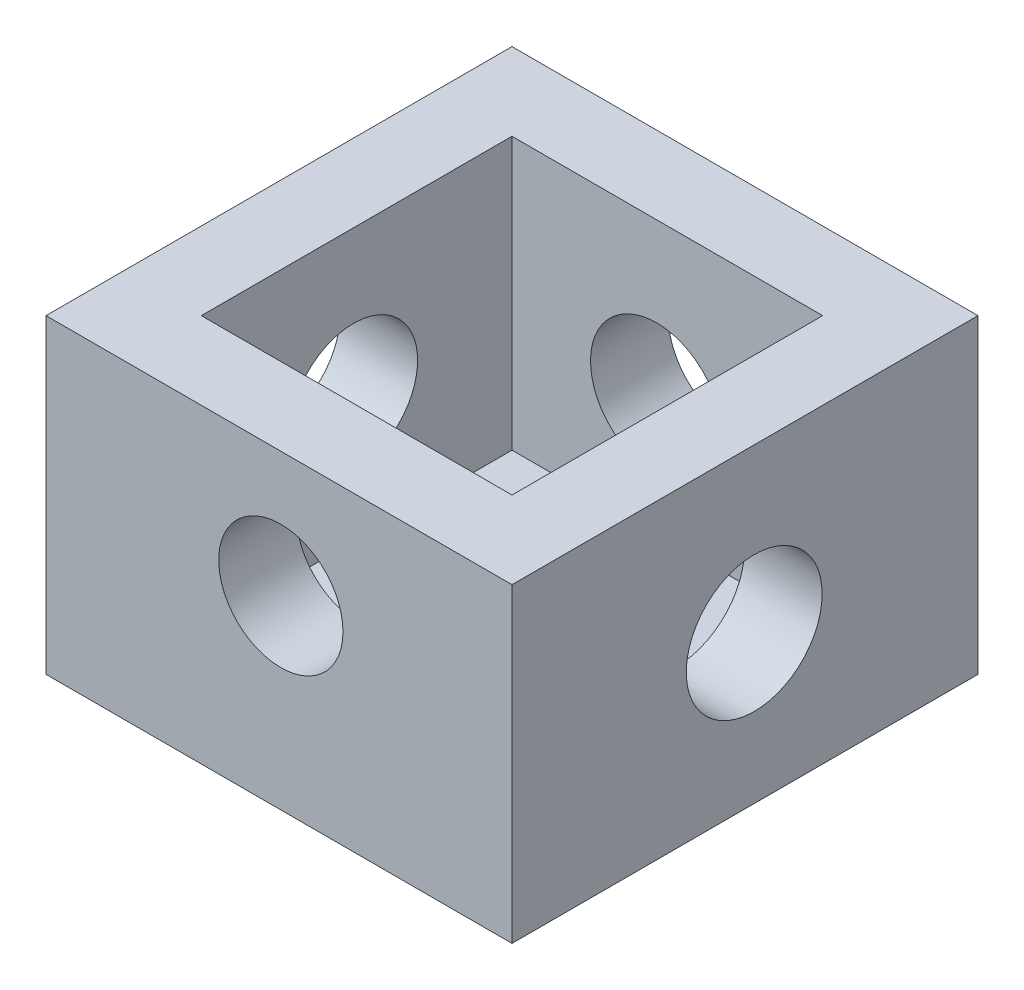
ISO-10303-21;
HEADER;
FILE_DESCRIPTION(('STEP AP214'),'2;1');
FILE_NAME('part.step','',(''),(''),'','','');
FILE_SCHEMA(('AUTOMOTIVE_DESIGN { 1 0 10303 214 1 1 1 1 }'));
ENDSEC;
DATA;
#1=APPLICATION_CONTEXT('core data for automotive mechanical design processes');
#2=APPLICATION_PROTOCOL_DEFINITION('international standard','automotive_design',2000,#1);
#3=PRODUCT_CONTEXT('',#1,'mechanical');
#4=PRODUCT('Part','Part','',(#3));
#5=PRODUCT_RELATED_PRODUCT_CATEGORY('part','',(#4));
#6=PRODUCT_DEFINITION_FORMATION('','',#4);
#7=PRODUCT_DEFINITION_CONTEXT('part definition',#1,'design');
#8=PRODUCT_DEFINITION('design','',#6,#7);
#9=PRODUCT_DEFINITION_SHAPE('','',#8);
#10=(LENGTH_UNIT() NAMED_UNIT(*) SI_UNIT(.MILLI.,.METRE.));
#11=(NAMED_UNIT(*) PLANE_ANGLE_UNIT() SI_UNIT($,.RADIAN.));
#12=(NAMED_UNIT(*) SI_UNIT($,.STERADIAN.) SOLID_ANGLE_UNIT());
#13=UNCERTAINTY_MEASURE_WITH_UNIT(LENGTH_MEASURE(1.E-05),#10,'distance_accuracy_value','');
#14=(GEOMETRIC_REPRESENTATION_CONTEXT(3) GLOBAL_UNCERTAINTY_ASSIGNED_CONTEXT((#13)) GLOBAL_UNIT_ASSIGNED_CONTEXT((#10,
#11,#12)) REPRESENTATION_CONTEXT('',''));
#15=CARTESIAN_POINT('',(0.,0.,0.));
#16=DIRECTION('',(0.,0.,1.));
#17=DIRECTION('',(1.,0.,0.));
#18=AXIS2_PLACEMENT_3D('',#15,#16,#17);
#19=CARTESIAN_POINT('',(-47.6315789473684,40.,-77.2368421052632));
#20=DIRECTION('',(0.,0.,1.));
#21=DIRECTION('',(1.,0.,0.));
#22=AXIS2_PLACEMENT_3D('',#19,#20,#21);
#23=PLANE('',#22);
#24=DIRECTION('',(-1.,0.,0.));
#25=VECTOR('',#24,1.);
#26=CARTESIAN_POINT('',(-47.6315789473684,0.,-77.2368421052632));
#27=LINE('',#26,#25);
#28=CARTESIAN_POINT('',(12.3684210526316,0.,-77.2368421052632));
#29=VERTEX_POINT('',#28);
#30=CARTESIAN_POINT('',(-47.6315789473684,0.,-77.2368421052632));
#31=VERTEX_POINT('',#30);
#32=EDGE_CURVE('E158',#29,#31,#27,.T.);
#33=ORIENTED_EDGE('',*,*,#32,.T.);
#34=DIRECTION('',(0.,-1.,0.));
#35=VECTOR('',#34,1.);
#36=CARTESIAN_POINT('',(-47.6315789473684,40.,-77.2368421052632));
#37=LINE('',#36,#35);
#38=CARTESIAN_POINT('',(-47.6315789473684,40.,-77.2368421052632));
#39=VERTEX_POINT('',#38);
#40=EDGE_CURVE('E41',#39,#31,#37,.T.);
#41=ORIENTED_EDGE('',*,*,#40,.F.);
#42=DIRECTION('',(-1.,0.,0.));
#43=VECTOR('',#42,1.);
#44=CARTESIAN_POINT('',(-47.6315789473684,40.,-77.2368421052632));
#45=LINE('',#44,#43);
#46=CARTESIAN_POINT('',(12.3684210526316,40.,-77.2368421052632));
#47=VERTEX_POINT('',#46);
#48=EDGE_CURVE('E85',#47,#39,#45,.T.);
#49=ORIENTED_EDGE('',*,*,#48,.F.);
#50=DIRECTION('',(0.,-1.,0.));
#51=VECTOR('',#50,1.);
#52=CARTESIAN_POINT('',(12.3684210526316,40.,-77.2368421052632));
#53=LINE('',#52,#51);
#54=EDGE_CURVE('E11',#47,#29,#53,.T.);
#55=ORIENTED_EDGE('',*,*,#54,.T.);
#56=EDGE_LOOP('',(#33,#41,#49,#55));
#57=FACE_BOUND('',#56,.T.);
#58=CARTESIAN_POINT('',(-19.022665383632,20.0118224268138,-77.2368421052632));
#59=DIRECTION('',(0.,0.,-1.));
#60=DIRECTION('',(-1.,0.,0.));
#61=AXIS2_PLACEMENT_3D('',#58,#59,#60);
#62=CIRCLE('',#61,8.5);
#63=CARTESIAN_POINT('',(-27.522665383632,20.0118224268138,-77.2368421052632));
#64=VERTEX_POINT('',#63);
#65=EDGE_CURVE('E200',#64,#64,#62,.T.);
#66=ORIENTED_EDGE('',*,*,#65,.F.);
#67=EDGE_LOOP('',(#66));
#68=FACE_BOUND('',#67,.T.);
#69=ADVANCED_FACE('F33',(#57,#68),#23,.F.);
#70=CARTESIAN_POINT('',(-47.6315789473684,40.,-77.2368421052632));
#71=DIRECTION('',(1.,0.,0.));
#72=DIRECTION('',(0.,0.,-1.));
#73=AXIS2_PLACEMENT_3D('',#70,#71,#72);
#74=PLANE('',#73);
#75=DIRECTION('',(0.,0.,1.));
#76=VECTOR('',#75,1.);
#77=CARTESIAN_POINT('',(-47.6315789473684,0.,-77.2368421052632));
#78=LINE('',#77,#76);
#79=CARTESIAN_POINT('',(-47.6315789473684,0.,-17.2368421052632));
#80=VERTEX_POINT('',#79);
#81=EDGE_CURVE('E160',#31,#80,#78,.T.);
#82=ORIENTED_EDGE('',*,*,#81,.T.);
#83=DIRECTION('',(0.,-1.,0.));
#84=VECTOR('',#83,1.);
#85=CARTESIAN_POINT('',(-47.6315789473684,40.,-17.2368421052632));
#86=LINE('',#85,#84);
#87=CARTESIAN_POINT('',(-47.6315789473684,40.,-17.2368421052632));
#88=VERTEX_POINT('',#87);
#89=EDGE_CURVE('E164',#88,#80,#86,.T.);
#90=ORIENTED_EDGE('',*,*,#89,.F.);
#91=DIRECTION('',(0.,0.,1.));
#92=VECTOR('',#91,1.);
#93=CARTESIAN_POINT('',(-47.6315789473684,40.,-77.2368421052632));
#94=LINE('',#93,#92);
#95=EDGE_CURVE('E152',#39,#88,#94,.T.);
#96=ORIENTED_EDGE('',*,*,#95,.F.);
#97=ORIENTED_EDGE('',*,*,#40,.T.);
#98=EDGE_LOOP('',(#82,#90,#96,#97));
#99=FACE_BOUND('',#98,.T.);
#100=CARTESIAN_POINT('',(-47.6315789473684,21.0932716684626,-46.8351131772574));
#101=DIRECTION('',(-1.,0.,0.));
#102=DIRECTION('',(0.,0.,1.));
#103=AXIS2_PLACEMENT_3D('',#100,#101,#102);
#104=CIRCLE('',#103,8.25);
#105=CARTESIAN_POINT('',(-47.6315789473684,21.0932716684626,-38.5851131772574));
#106=VERTEX_POINT('',#105);
#107=EDGE_CURVE('E205',#106,#106,#104,.T.);
#108=ORIENTED_EDGE('',*,*,#107,.F.);
#109=EDGE_LOOP('',(#108));
#110=FACE_BOUND('',#109,.T.);
#111=ADVANCED_FACE('F169',(#99,#110),#74,.F.);
#112=CARTESIAN_POINT('',(12.3684210526316,40.,-77.2368421052632));
#113=DIRECTION('',(-1.,0.,0.));
#114=DIRECTION('',(0.,0.,1.));
#115=AXIS2_PLACEMENT_3D('',#112,#113,#114);
#116=PLANE('',#115);
#117=DIRECTION('',(0.,0.,-1.));
#118=VECTOR('',#117,1.);
#119=CARTESIAN_POINT('',(12.3684210526316,0.,-77.2368421052632));
#120=LINE('',#119,#118);
#121=CARTESIAN_POINT('',(12.3684210526316,0.,-17.2368421052632));
#122=VERTEX_POINT('',#121);
#123=EDGE_CURVE('E145',#122,#29,#120,.T.);
#124=ORIENTED_EDGE('',*,*,#123,.T.);
#125=ORIENTED_EDGE('',*,*,#54,.F.);
#126=DIRECTION('',(0.,0.,-1.));
#127=VECTOR('',#126,1.);
#128=CARTESIAN_POINT('',(12.3684210526316,40.,-77.2368421052632));
#129=LINE('',#128,#127);
#130=CARTESIAN_POINT('',(12.3684210526316,40.,-17.2368421052632));
#131=VERTEX_POINT('',#130);
#132=EDGE_CURVE('E149',#131,#47,#129,.T.);
#133=ORIENTED_EDGE('',*,*,#132,.F.);
#134=DIRECTION('',(0.,-1.,0.));
#135=VECTOR('',#134,1.);
#136=CARTESIAN_POINT('',(12.3684210526316,40.,-17.2368421052632));
#137=LINE('',#136,#135);
#138=EDGE_CURVE('E155',#131,#122,#137,.T.);
#139=ORIENTED_EDGE('',*,*,#138,.T.);
#140=EDGE_LOOP('',(#124,#125,#133,#139));
#141=FACE_BOUND('',#140,.T.);
#142=CARTESIAN_POINT('',(12.3684210526316,19.0144091342364,-48.4215666866429));
#143=DIRECTION('',(1.,0.,0.));
#144=DIRECTION('',(0.,0.,-1.));
#145=AXIS2_PLACEMENT_3D('',#142,#143,#144);
#146=CIRCLE('',#145,8.75);
#147=CARTESIAN_POINT('',(12.3684210526316,19.0144091342364,-57.1715666866429));
#148=VERTEX_POINT('',#147);
#149=EDGE_CURVE('E213',#148,#148,#146,.T.);
#150=ORIENTED_EDGE('',*,*,#149,.F.);
#151=EDGE_LOOP('',(#150));
#152=FACE_BOUND('',#151,.T.);
#153=ADVANCED_FACE('F35',(#141,#152),#116,.F.);
#154=CARTESIAN_POINT('',(-47.6315789473684,40.,-17.2368421052632));
#155=DIRECTION('',(0.,0.,-1.));
#156=DIRECTION('',(-1.,0.,0.));
#157=AXIS2_PLACEMENT_3D('',#154,#155,#156);
#158=PLANE('',#157);
#159=CARTESIAN_POINT('',(-17.3938566500453,23.8673899247033,-17.2368421052632));
#160=DIRECTION('',(0.,0.,1.));
#161=DIRECTION('',(1.,0.,0.));
#162=AXIS2_PLACEMENT_3D('',#159,#160,#161);
#163=CIRCLE('',#162,8.);
#164=CARTESIAN_POINT('',(-9.39385665004534,23.8673899247033,-17.2368421052632));
#165=VERTEX_POINT('',#164);
#166=EDGE_CURVE('E218',#165,#165,#163,.T.);
#167=ORIENTED_EDGE('',*,*,#166,.F.);
#168=EDGE_LOOP('',(#167));
#169=FACE_BOUND('',#168,.T.);
#170=DIRECTION('',(1.,0.,0.));
#171=VECTOR('',#170,1.);
#172=CARTESIAN_POINT('',(-47.6315789473684,0.,-17.2368421052632));
#173=LINE('',#172,#171);
#174=EDGE_CURVE('E78',#80,#122,#173,.T.);
#175=ORIENTED_EDGE('',*,*,#174,.T.);
#176=ORIENTED_EDGE('',*,*,#138,.F.);
#177=DIRECTION('',(1.,0.,0.));
#178=VECTOR('',#177,1.);
#179=CARTESIAN_POINT('',(-47.6315789473684,40.,-17.2368421052632));
#180=LINE('',#179,#178);
#181=EDGE_CURVE('E57',#88,#131,#180,.T.);
#182=ORIENTED_EDGE('',*,*,#181,.F.);
#183=ORIENTED_EDGE('',*,*,#89,.T.);
#184=EDGE_LOOP('',(#175,#176,#182,#183));
#185=FACE_BOUND('',#184,.T.);
#186=ADVANCED_FACE('F179',(#169,#185),#158,.F.);
#187=CARTESIAN_POINT('',(0.,40.,0.));
#188=DIRECTION('',(0.,1.,0.));
#189=DIRECTION('',(0.,0.,1.));
#190=AXIS2_PLACEMENT_3D('',#187,#188,#189);
#191=PLANE('',#190);
#192=DIRECTION('',(0.,0.,-1.));
#193=VECTOR('',#192,1.);
#194=CARTESIAN_POINT('',(2.36842105263158,40.,-67.2368421052632));
#195=LINE('',#194,#193);
#196=CARTESIAN_POINT('',(2.36842105263158,40.,-27.2368421052632));
#197=VERTEX_POINT('',#196);
#198=CARTESIAN_POINT('',(2.36842105263158,40.,-67.2368421052632));
#199=VERTEX_POINT('',#198);
#200=EDGE_CURVE('E48',#197,#199,#195,.T.);
#201=ORIENTED_EDGE('',*,*,#200,.F.);
#202=DIRECTION('',(1.,0.,0.));
#203=VECTOR('',#202,1.);
#204=CARTESIAN_POINT('',(-37.6315789473684,40.,-27.2368421052632));
#205=LINE('',#204,#203);
#206=CARTESIAN_POINT('',(-37.6315789473684,40.,-27.2368421052632));
#207=VERTEX_POINT('',#206);
#208=EDGE_CURVE('E127',#207,#197,#205,.T.);
#209=ORIENTED_EDGE('',*,*,#208,.F.);
#210=DIRECTION('',(0.,0.,1.));
#211=VECTOR('',#210,1.);
#212=CARTESIAN_POINT('',(-37.6315789473684,40.,-67.2368421052632));
#213=LINE('',#212,#211);
#214=CARTESIAN_POINT('',(-37.6315789473684,40.,-67.2368421052632));
#215=VERTEX_POINT('',#214);
#216=EDGE_CURVE('E130',#215,#207,#213,.T.);
#217=ORIENTED_EDGE('',*,*,#216,.F.);
#218=DIRECTION('',(-1.,0.,0.));
#219=VECTOR('',#218,1.);
#220=CARTESIAN_POINT('',(-37.6315789473684,40.,-67.2368421052632));
#221=LINE('',#220,#219);
#222=EDGE_CURVE('E139',#199,#215,#221,.T.);
#223=ORIENTED_EDGE('',*,*,#222,.F.);
#224=EDGE_LOOP('',(#201,#209,#217,#223));
#225=FACE_BOUND('',#224,.T.);
#226=ORIENTED_EDGE('',*,*,#132,.T.);
#227=ORIENTED_EDGE('',*,*,#48,.T.);
#228=ORIENTED_EDGE('',*,*,#95,.T.);
#229=ORIENTED_EDGE('',*,*,#181,.T.);
#230=EDGE_LOOP('',(#226,#227,#228,#229));
#231=FACE_BOUND('',#230,.T.);
#232=ADVANCED_FACE('F181',(#225,#231),#191,.T.);
#233=CARTESIAN_POINT('',(0.,0.,0.));
#234=DIRECTION('',(0.,1.,0.));
#235=DIRECTION('',(0.,0.,1.));
#236=AXIS2_PLACEMENT_3D('',#233,#234,#235);
#237=PLANE('',#236);
#238=ORIENTED_EDGE('',*,*,#123,.F.);
#239=ORIENTED_EDGE('',*,*,#174,.F.);
#240=ORIENTED_EDGE('',*,*,#81,.F.);
#241=ORIENTED_EDGE('',*,*,#32,.F.);
#242=EDGE_LOOP('',(#238,#239,#240,#241));
#243=FACE_BOUND('',#242,.T.);
#244=ADVANCED_FACE('F174',(#243),#237,.F.);
#245=CARTESIAN_POINT('',(2.36842105263158,5.,-67.2368421052632));
#246=DIRECTION('',(1.,0.,0.));
#247=DIRECTION('',(0.,0.,-1.));
#248=AXIS2_PLACEMENT_3D('',#245,#246,#247);
#249=PLANE('',#248);
#250=CARTESIAN_POINT('',(2.36842105263158,19.0144091342364,-48.4215666866429));
#251=DIRECTION('',(1.,0.,0.));
#252=DIRECTION('',(0.,0.,-1.));
#253=AXIS2_PLACEMENT_3D('',#250,#251,#252);
#254=CIRCLE('',#253,8.75);
#255=CARTESIAN_POINT('',(2.36842105263158,19.0144091342364,-57.1715666866429));
#256=VERTEX_POINT('',#255);
#257=EDGE_CURVE('E216',#256,#256,#254,.T.);
#258=ORIENTED_EDGE('',*,*,#257,.T.);
#259=EDGE_LOOP('',(#258));
#260=FACE_BOUND('',#259,.T.);
#261=ORIENTED_EDGE('',*,*,#200,.T.);
#262=DIRECTION('',(0.,1.,0.));
#263=VECTOR('',#262,1.);
#264=CARTESIAN_POINT('',(2.36842105263158,5.,-67.2368421052632));
#265=LINE('',#264,#263);
#266=CARTESIAN_POINT('',(2.36842105263158,5.,-67.2368421052632));
#267=VERTEX_POINT('',#266);
#268=EDGE_CURVE('E105',#267,#199,#265,.T.);
#269=ORIENTED_EDGE('',*,*,#268,.F.);
#270=DIRECTION('',(0.,0.,-1.));
#271=VECTOR('',#270,1.);
#272=CARTESIAN_POINT('',(2.36842105263158,5.,-67.2368421052632));
#273=LINE('',#272,#271);
#274=CARTESIAN_POINT('',(2.36842105263158,5.,-27.2368421052632));
#275=VERTEX_POINT('',#274);
#276=EDGE_CURVE('E109',#275,#267,#273,.T.);
#277=ORIENTED_EDGE('',*,*,#276,.F.);
#278=DIRECTION('',(0.,1.,0.));
#279=VECTOR('',#278,1.);
#280=CARTESIAN_POINT('',(2.36842105263158,5.,-27.2368421052632));
#281=LINE('',#280,#279);
#282=EDGE_CURVE('E143',#275,#197,#281,.T.);
#283=ORIENTED_EDGE('',*,*,#282,.T.);
#284=EDGE_LOOP('',(#261,#269,#277,#283));
#285=FACE_BOUND('',#284,.T.);
#286=ADVANCED_FACE('F107',(#260,#285),#249,.F.);
#287=CARTESIAN_POINT('',(-37.6315789473684,5.,-27.2368421052632));
#288=DIRECTION('',(0.,0.,1.));
#289=DIRECTION('',(1.,0.,0.));
#290=AXIS2_PLACEMENT_3D('',#287,#288,#289);
#291=PLANE('',#290);
#292=CARTESIAN_POINT('',(-17.3938566500453,23.8673899247033,-27.2368421052632));
#293=DIRECTION('',(0.,0.,1.));
#294=DIRECTION('',(1.,0.,0.));
#295=AXIS2_PLACEMENT_3D('',#292,#293,#294);
#296=CIRCLE('',#295,8.);
#297=CARTESIAN_POINT('',(-9.39385665004534,23.8673899247033,-27.2368421052632));
#298=VERTEX_POINT('',#297);
#299=EDGE_CURVE('E133',#298,#298,#296,.T.);
#300=ORIENTED_EDGE('',*,*,#299,.T.);
#301=EDGE_LOOP('',(#300));
#302=FACE_BOUND('',#301,.T.);
#303=ORIENTED_EDGE('',*,*,#208,.T.);
#304=ORIENTED_EDGE('',*,*,#282,.F.);
#305=DIRECTION('',(1.,0.,0.));
#306=VECTOR('',#305,1.);
#307=CARTESIAN_POINT('',(-37.6315789473684,5.,-27.2368421052632));
#308=LINE('',#307,#306);
#309=CARTESIAN_POINT('',(-37.6315789473684,5.,-27.2368421052632));
#310=VERTEX_POINT('',#309);
#311=EDGE_CURVE('E115',#310,#275,#308,.T.);
#312=ORIENTED_EDGE('',*,*,#311,.F.);
#313=DIRECTION('',(0.,1.,0.));
#314=VECTOR('',#313,1.);
#315=CARTESIAN_POINT('',(-37.6315789473684,5.,-27.2368421052632));
#316=LINE('',#315,#314);
#317=EDGE_CURVE('E146',#310,#207,#316,.T.);
#318=ORIENTED_EDGE('',*,*,#317,.T.);
#319=EDGE_LOOP('',(#303,#304,#312,#318));
#320=FACE_BOUND('',#319,.T.);
#321=ADVANCED_FACE('F224',(#302,#320),#291,.F.);
#322=CARTESIAN_POINT('',(-37.6315789473684,5.,-67.2368421052632));
#323=DIRECTION('',(-1.,0.,0.));
#324=DIRECTION('',(0.,0.,1.));
#325=AXIS2_PLACEMENT_3D('',#322,#323,#324);
#326=PLANE('',#325);
#327=CARTESIAN_POINT('',(-37.6315789473684,21.0932716684626,-46.8351131772574));
#328=DIRECTION('',(-1.,0.,0.));
#329=DIRECTION('',(0.,0.,1.));
#330=AXIS2_PLACEMENT_3D('',#327,#328,#329);
#331=CIRCLE('',#330,8.25);
#332=CARTESIAN_POINT('',(-37.6315789473684,21.0932716684626,-38.5851131772574));
#333=VERTEX_POINT('',#332);
#334=EDGE_CURVE('E210',#333,#333,#331,.T.);
#335=ORIENTED_EDGE('',*,*,#334,.T.);
#336=EDGE_LOOP('',(#335));
#337=FACE_BOUND('',#336,.T.);
#338=ORIENTED_EDGE('',*,*,#216,.T.);
#339=ORIENTED_EDGE('',*,*,#317,.F.);
#340=DIRECTION('',(0.,0.,1.));
#341=VECTOR('',#340,1.);
#342=CARTESIAN_POINT('',(-37.6315789473684,5.,-67.2368421052632));
#343=LINE('',#342,#341);
#344=CARTESIAN_POINT('',(-37.6315789473684,5.,-67.2368421052632));
#345=VERTEX_POINT('',#344);
#346=EDGE_CURVE('E123',#345,#310,#343,.T.);
#347=ORIENTED_EDGE('',*,*,#346,.F.);
#348=DIRECTION('',(0.,1.,0.));
#349=VECTOR('',#348,1.);
#350=CARTESIAN_POINT('',(-37.6315789473684,5.,-67.2368421052632));
#351=LINE('',#350,#349);
#352=EDGE_CURVE('E114',#345,#215,#351,.T.);
#353=ORIENTED_EDGE('',*,*,#352,.T.);
#354=EDGE_LOOP('',(#338,#339,#347,#353));
#355=FACE_BOUND('',#354,.T.);
#356=ADVANCED_FACE('F243',(#337,#355),#326,.F.);
#357=CARTESIAN_POINT('',(-37.6315789473684,5.,-67.2368421052632));
#358=DIRECTION('',(0.,0.,-1.));
#359=DIRECTION('',(-1.,0.,0.));
#360=AXIS2_PLACEMENT_3D('',#357,#358,#359);
#361=PLANE('',#360);
#362=CARTESIAN_POINT('',(-19.022665383632,20.0118224268138,-67.2368421052632));
#363=DIRECTION('',(0.,0.,-1.));
#364=DIRECTION('',(-1.,0.,0.));
#365=AXIS2_PLACEMENT_3D('',#362,#363,#364);
#366=CIRCLE('',#365,8.5);
#367=CARTESIAN_POINT('',(-27.522665383632,20.0118224268138,-67.2368421052632));
#368=VERTEX_POINT('',#367);
#369=EDGE_CURVE('E202',#368,#368,#366,.T.);
#370=ORIENTED_EDGE('',*,*,#369,.T.);
#371=EDGE_LOOP('',(#370));
#372=FACE_BOUND('',#371,.T.);
#373=ORIENTED_EDGE('',*,*,#222,.T.);
#374=ORIENTED_EDGE('',*,*,#352,.F.);
#375=DIRECTION('',(-1.,0.,0.));
#376=VECTOR('',#375,1.);
#377=CARTESIAN_POINT('',(-37.6315789473684,5.,-67.2368421052632));
#378=LINE('',#377,#376);
#379=EDGE_CURVE('E118',#267,#345,#378,.T.);
#380=ORIENTED_EDGE('',*,*,#379,.F.);
#381=ORIENTED_EDGE('',*,*,#268,.T.);
#382=EDGE_LOOP('',(#373,#374,#380,#381));
#383=FACE_BOUND('',#382,.T.);
#384=ADVANCED_FACE('F119',(#372,#383),#361,.F.);
#385=CARTESIAN_POINT('',(0.,5.,0.));
#386=DIRECTION('',(0.,1.,0.));
#387=DIRECTION('',(0.,0.,1.));
#388=AXIS2_PLACEMENT_3D('',#385,#386,#387);
#389=PLANE('',#388);
#390=ORIENTED_EDGE('',*,*,#276,.T.);
#391=ORIENTED_EDGE('',*,*,#379,.T.);
#392=ORIENTED_EDGE('',*,*,#346,.T.);
#393=ORIENTED_EDGE('',*,*,#311,.T.);
#394=EDGE_LOOP('',(#390,#391,#392,#393));
#395=FACE_BOUND('',#394,.T.);
#396=ADVANCED_FACE('F125',(#395),#389,.T.);
#397=CARTESIAN_POINT('',(-17.3938566500453,23.8673899247033,-17.2368421052632));
#398=DIRECTION('',(0.,0.,1.));
#399=DIRECTION('',(1.,0.,0.));
#400=AXIS2_PLACEMENT_3D('',#397,#398,#399);
#401=CYLINDRICAL_SURFACE('',#400,8.);
#402=ORIENTED_EDGE('',*,*,#299,.F.);
#403=EDGE_LOOP('',(#402));
#404=FACE_BOUND('',#403,.T.);
#405=ORIENTED_EDGE('',*,*,#166,.T.);
#406=EDGE_LOOP('',(#405));
#407=FACE_BOUND('',#406,.T.);
#408=ADVANCED_FACE('F227',(#404,#407),#401,.F.);
#409=CARTESIAN_POINT('',(12.3684210526316,19.0144091342364,-48.4215666866429));
#410=DIRECTION('',(1.,0.,0.));
#411=DIRECTION('',(0.,0.,-1.));
#412=AXIS2_PLACEMENT_3D('',#409,#410,#411);
#413=CYLINDRICAL_SURFACE('',#412,8.75);
#414=ORIENTED_EDGE('',*,*,#257,.F.);
#415=EDGE_LOOP('',(#414));
#416=FACE_BOUND('',#415,.T.);
#417=ORIENTED_EDGE('',*,*,#149,.T.);
#418=EDGE_LOOP('',(#417));
#419=FACE_BOUND('',#418,.T.);
#420=ADVANCED_FACE('F229',(#416,#419),#413,.F.);
#421=CARTESIAN_POINT('',(-47.6315789473684,21.0932716684626,-46.8351131772574));
#422=DIRECTION('',(-1.,0.,0.));
#423=DIRECTION('',(0.,0.,1.));
#424=AXIS2_PLACEMENT_3D('',#421,#422,#423);
#425=CYLINDRICAL_SURFACE('',#424,8.25);
#426=ORIENTED_EDGE('',*,*,#334,.F.);
#427=EDGE_LOOP('',(#426));
#428=FACE_BOUND('',#427,.T.);
#429=ORIENTED_EDGE('',*,*,#107,.T.);
#430=EDGE_LOOP('',(#429));
#431=FACE_BOUND('',#430,.T.);
#432=ADVANCED_FACE('F235',(#428,#431),#425,.F.);
#433=CARTESIAN_POINT('',(-19.022665383632,20.0118224268138,-77.2368421052632));
#434=DIRECTION('',(0.,0.,-1.));
#435=DIRECTION('',(-1.,0.,0.));
#436=AXIS2_PLACEMENT_3D('',#433,#434,#435);
#437=CYLINDRICAL_SURFACE('',#436,8.5);
#438=ORIENTED_EDGE('',*,*,#369,.F.);
#439=EDGE_LOOP('',(#438));
#440=FACE_BOUND('',#439,.T.);
#441=ORIENTED_EDGE('',*,*,#65,.T.);
#442=EDGE_LOOP('',(#441));
#443=FACE_BOUND('',#442,.T.);
#444=ADVANCED_FACE('F325',(#440,#443),#437,.F.);
#445=CLOSED_SHELL('',(#69,#111,#153,#186,#232,#244,#286,#321,#356,#384,#396,#408,#420,#432,#444));
#446=MANIFOLD_SOLID_BREP('B2',#445);
#447=ADVANCED_BREP_SHAPE_REPRESENTATION('',(#18,#446),#14);
#448=SHAPE_DEFINITION_REPRESENTATION(#9,#447);
ENDSEC;
END-ISO-10303-21;
